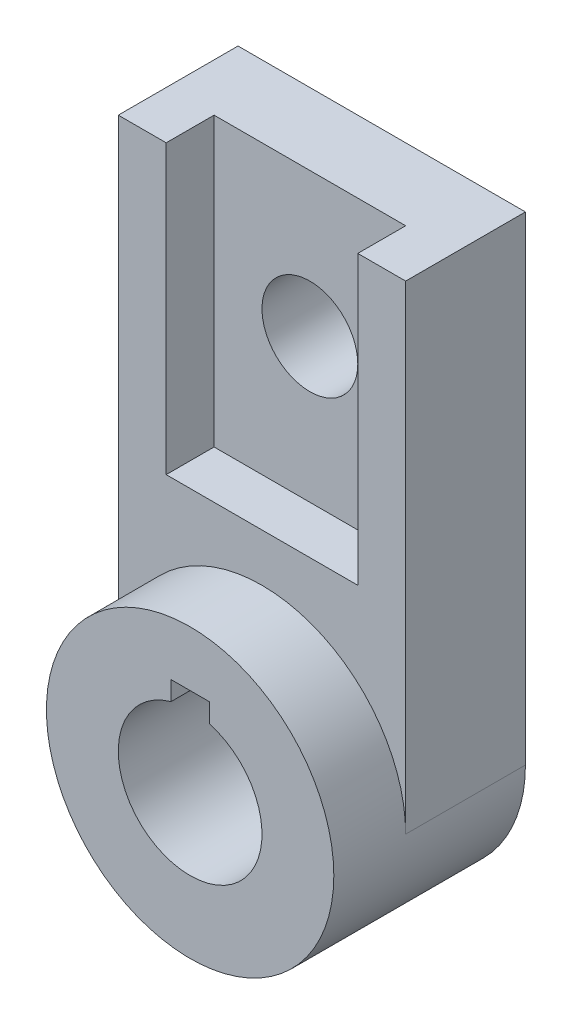
ISO-10303-21;
HEADER;
FILE_DESCRIPTION(('STEP AP214'),'2;1');
FILE_NAME('part.step','',(''),(''),'','','');
FILE_SCHEMA(('AUTOMOTIVE_DESIGN { 1 0 10303 214 1 1 1 1 }'));
ENDSEC;
DATA;
#1=APPLICATION_CONTEXT('core data for automotive mechanical design processes');
#2=APPLICATION_PROTOCOL_DEFINITION('international standard','automotive_design',2000,#1);
#3=PRODUCT_CONTEXT('',#1,'mechanical');
#4=PRODUCT('Part','Part','',(#3));
#5=PRODUCT_RELATED_PRODUCT_CATEGORY('part','',(#4));
#6=PRODUCT_DEFINITION_FORMATION('','',#4);
#7=PRODUCT_DEFINITION_CONTEXT('part definition',#1,'design');
#8=PRODUCT_DEFINITION('design','',#6,#7);
#9=PRODUCT_DEFINITION_SHAPE('','',#8);
#10=(LENGTH_UNIT() NAMED_UNIT(*) SI_UNIT(.MILLI.,.METRE.));
#11=(NAMED_UNIT(*) PLANE_ANGLE_UNIT() SI_UNIT($,.RADIAN.));
#12=(NAMED_UNIT(*) SI_UNIT($,.STERADIAN.) SOLID_ANGLE_UNIT());
#13=UNCERTAINTY_MEASURE_WITH_UNIT(LENGTH_MEASURE(1.E-05),#10,'distance_accuracy_value','');
#14=(GEOMETRIC_REPRESENTATION_CONTEXT(3) GLOBAL_UNCERTAINTY_ASSIGNED_CONTEXT((#13)) GLOBAL_UNIT_ASSIGNED_CONTEXT((#10,
#11,#12)) REPRESENTATION_CONTEXT('',''));
#15=CARTESIAN_POINT('',(0.,0.,0.));
#16=DIRECTION('',(0.,0.,1.));
#17=DIRECTION('',(1.,0.,0.));
#18=AXIS2_PLACEMENT_3D('',#15,#16,#17);
#19=CARTESIAN_POINT('',(30.,0.,25.));
#20=DIRECTION('',(1.,0.,0.));
#21=DIRECTION('',(0.,1.,0.));
#22=AXIS2_PLACEMENT_3D('',#19,#20,#21);
#23=PLANE('',#22);
#24=DIRECTION('',(0.,-1.,0.));
#25=VECTOR('',#24,1.);
#26=CARTESIAN_POINT('',(30.,0.,0.));
#27=LINE('',#26,#25);
#28=CARTESIAN_POINT('',(30.,100.,0.));
#29=VERTEX_POINT('',#28);
#30=CARTESIAN_POINT('',(30.,0.,0.));
#31=VERTEX_POINT('',#30);
#32=EDGE_CURVE('E168',#29,#31,#27,.T.);
#33=ORIENTED_EDGE('',*,*,#32,.F.);
#34=DIRECTION('',(0.,0.,-1.));
#35=VECTOR('',#34,1.);
#36=CARTESIAN_POINT('',(30.,100.,25.));
#37=LINE('',#36,#35);
#38=CARTESIAN_POINT('',(30.,100.,25.));
#39=VERTEX_POINT('',#38);
#40=EDGE_CURVE('E153',#39,#29,#37,.T.);
#41=ORIENTED_EDGE('',*,*,#40,.F.);
#42=DIRECTION('',(0.,-1.,0.));
#43=VECTOR('',#42,1.);
#44=CARTESIAN_POINT('',(30.,0.,25.));
#45=LINE('',#44,#43);
#46=CARTESIAN_POINT('',(30.,0.,25.));
#47=VERTEX_POINT('',#46);
#48=EDGE_CURVE('E178',#39,#47,#45,.T.);
#49=ORIENTED_EDGE('',*,*,#48,.T.);
#50=DIRECTION('',(0.,0.,-1.));
#51=VECTOR('',#50,1.);
#52=CARTESIAN_POINT('',(30.,0.,25.));
#53=LINE('',#52,#51);
#54=EDGE_CURVE('E139',#47,#31,#53,.T.);
#55=ORIENTED_EDGE('',*,*,#54,.T.);
#56=EDGE_LOOP('',(#33,#41,#49,#55));
#57=FACE_BOUND('',#56,.T.);
#58=ADVANCED_FACE('F39',(#57),#23,.T.);
#59=CARTESIAN_POINT('',(0.,100.,25.));
#60=DIRECTION('',(0.,1.,0.));
#61=DIRECTION('',(0.,0.,1.));
#62=AXIS2_PLACEMENT_3D('',#59,#60,#61);
#63=PLANE('',#62);
#64=DIRECTION('',(0.,0.,1.));
#65=VECTOR('',#64,1.);
#66=CARTESIAN_POINT('',(-20.,100.,15.));
#67=LINE('',#66,#65);
#68=CARTESIAN_POINT('',(-20.,100.,15.));
#69=VERTEX_POINT('',#68);
#70=CARTESIAN_POINT('',(-20.,100.,25.));
#71=VERTEX_POINT('',#70);
#72=EDGE_CURVE('E184',#69,#71,#67,.T.);
#73=ORIENTED_EDGE('',*,*,#72,.F.);
#74=DIRECTION('',(-1.,0.,0.));
#75=VECTOR('',#74,1.);
#76=CARTESIAN_POINT('',(-20.,100.,15.));
#77=LINE('',#76,#75);
#78=CARTESIAN_POINT('',(20.,100.,15.));
#79=VERTEX_POINT('',#78);
#80=EDGE_CURVE('E191',#79,#69,#77,.T.);
#81=ORIENTED_EDGE('',*,*,#80,.F.);
#82=DIRECTION('',(0.,0.,1.));
#83=VECTOR('',#82,1.);
#84=CARTESIAN_POINT('',(20.,100.,15.));
#85=LINE('',#84,#83);
#86=CARTESIAN_POINT('',(20.,100.,25.));
#87=VERTEX_POINT('',#86);
#88=EDGE_CURVE('E193',#79,#87,#85,.T.);
#89=ORIENTED_EDGE('',*,*,#88,.T.);
#90=DIRECTION('',(1.,0.,0.));
#91=VECTOR('',#90,1.);
#92=CARTESIAN_POINT('',(0.,100.,25.));
#93=LINE('',#92,#91);
#94=EDGE_CURVE('E177',#87,#39,#93,.T.);
#95=ORIENTED_EDGE('',*,*,#94,.T.);
#96=ORIENTED_EDGE('',*,*,#40,.T.);
#97=DIRECTION('',(1.,0.,0.));
#98=VECTOR('',#97,1.);
#99=CARTESIAN_POINT('',(0.,100.,0.));
#100=LINE('',#99,#98);
#101=CARTESIAN_POINT('',(-30.,100.,0.));
#102=VERTEX_POINT('',#101);
#103=EDGE_CURVE('E165',#102,#29,#100,.T.);
#104=ORIENTED_EDGE('',*,*,#103,.F.);
#105=DIRECTION('',(0.,0.,-1.));
#106=VECTOR('',#105,1.);
#107=CARTESIAN_POINT('',(-30.,100.,25.));
#108=LINE('',#107,#106);
#109=CARTESIAN_POINT('',(-30.,100.,25.));
#110=VERTEX_POINT('',#109);
#111=EDGE_CURVE('E155',#110,#102,#108,.T.);
#112=ORIENTED_EDGE('',*,*,#111,.F.);
#113=EDGE_CURVE('E174',#110,#71,#93,.T.);
#114=ORIENTED_EDGE('',*,*,#113,.T.);
#115=EDGE_LOOP('',(#73,#81,#89,#95,#96,#104,#112,#114));
#116=FACE_BOUND('',#115,.T.);
#117=ADVANCED_FACE('F246',(#116),#63,.T.);
#118=CARTESIAN_POINT('',(-30.,0.,25.));
#119=DIRECTION('',(-1.,0.,0.));
#120=DIRECTION('',(0.,-1.,0.));
#121=AXIS2_PLACEMENT_3D('',#118,#119,#120);
#122=PLANE('',#121);
#123=DIRECTION('',(0.,1.,0.));
#124=VECTOR('',#123,1.);
#125=CARTESIAN_POINT('',(-30.,0.,0.));
#126=LINE('',#125,#124);
#127=CARTESIAN_POINT('',(-30.,0.,0.));
#128=VERTEX_POINT('',#127);
#129=EDGE_CURVE('E161',#128,#102,#126,.T.);
#130=ORIENTED_EDGE('',*,*,#129,.F.);
#131=DIRECTION('',(0.,0.,-1.));
#132=VECTOR('',#131,1.);
#133=CARTESIAN_POINT('',(-30.,0.,25.));
#134=LINE('',#133,#132);
#135=CARTESIAN_POINT('',(-30.,0.,25.));
#136=VERTEX_POINT('',#135);
#137=EDGE_CURVE('E157',#136,#128,#134,.T.);
#138=ORIENTED_EDGE('',*,*,#137,.F.);
#139=DIRECTION('',(0.,1.,0.));
#140=VECTOR('',#139,1.);
#141=CARTESIAN_POINT('',(-30.,0.,25.));
#142=LINE('',#141,#140);
#143=EDGE_CURVE('E160',#136,#110,#142,.T.);
#144=ORIENTED_EDGE('',*,*,#143,.T.);
#145=ORIENTED_EDGE('',*,*,#111,.T.);
#146=EDGE_LOOP('',(#130,#138,#144,#145));
#147=FACE_BOUND('',#146,.T.);
#148=ADVANCED_FACE('F252',(#147),#122,.T.);
#149=CARTESIAN_POINT('',(0.,0.,25.));
#150=DIRECTION('',(0.,0.,1.));
#151=DIRECTION('',(1.,0.,0.));
#152=AXIS2_PLACEMENT_3D('',#149,#150,#151);
#153=PLANE('',#152);
#154=DIRECTION('',(0.,-1.,0.));
#155=VECTOR('',#154,1.);
#156=CARTESIAN_POINT('',(-20.,100.,25.));
#157=LINE('',#156,#155);
#158=CARTESIAN_POINT('',(-20.,40.,25.));
#159=VERTEX_POINT('',#158);
#160=EDGE_CURVE('E149',#71,#159,#157,.T.);
#161=ORIENTED_EDGE('',*,*,#160,.F.);
#162=ORIENTED_EDGE('',*,*,#113,.F.);
#163=ORIENTED_EDGE('',*,*,#143,.F.);
#164=CARTESIAN_POINT('',(0.,0.,25.));
#165=DIRECTION('',(0.,0.,1.));
#166=DIRECTION('',(1.,0.,0.));
#167=AXIS2_PLACEMENT_3D('',#164,#165,#166);
#168=CIRCLE('',#167,30.);
#169=EDGE_CURVE('E164',#47,#136,#168,.T.);
#170=ORIENTED_EDGE('',*,*,#169,.F.);
#171=ORIENTED_EDGE('',*,*,#48,.F.);
#172=ORIENTED_EDGE('',*,*,#94,.F.);
#173=DIRECTION('',(0.,1.,0.));
#174=VECTOR('',#173,1.);
#175=CARTESIAN_POINT('',(20.,100.,25.));
#176=LINE('',#175,#174);
#177=CARTESIAN_POINT('',(20.,40.,25.));
#178=VERTEX_POINT('',#177);
#179=EDGE_CURVE('E197',#178,#87,#176,.T.);
#180=ORIENTED_EDGE('',*,*,#179,.F.);
#181=DIRECTION('',(1.,0.,0.));
#182=VECTOR('',#181,1.);
#183=CARTESIAN_POINT('',(-20.,40.,25.));
#184=LINE('',#183,#182);
#185=EDGE_CURVE('E200',#159,#178,#184,.T.);
#186=ORIENTED_EDGE('',*,*,#185,.F.);
#187=EDGE_LOOP('',(#161,#162,#163,#170,#171,#172,#180,#186));
#188=FACE_BOUND('',#187,.T.);
#189=ADVANCED_FACE('F267',(#188),#153,.T.);
#190=CARTESIAN_POINT('',(0.,0.,0.));
#191=DIRECTION('',(0.,0.,1.));
#192=DIRECTION('',(1.,0.,0.));
#193=AXIS2_PLACEMENT_3D('',#190,#191,#192);
#194=PLANE('',#193);
#195=DIRECTION('',(-1.,0.,0.));
#196=VECTOR('',#195,1.);
#197=CARTESIAN_POINT('',(-4.,18.456832294801,0.));
#198=LINE('',#197,#196);
#199=CARTESIAN_POINT('',(4.,18.456832294801,0.));
#200=VERTEX_POINT('',#199);
#201=CARTESIAN_POINT('',(-4.,18.456832294801,0.));
#202=VERTEX_POINT('',#201);
#203=EDGE_CURVE('E218',#200,#202,#198,.T.);
#204=ORIENTED_EDGE('',*,*,#203,.T.);
#205=DIRECTION('',(0.,-1.,0.));
#206=VECTOR('',#205,1.);
#207=CARTESIAN_POINT('',(-4.,18.456832294801,0.));
#208=LINE('',#207,#206);
#209=CARTESIAN_POINT('',(-4.,14.456832294801,0.));
#210=VERTEX_POINT('',#209);
#211=EDGE_CURVE('E227',#202,#210,#208,.T.);
#212=ORIENTED_EDGE('',*,*,#211,.T.);
#213=CARTESIAN_POINT('',(0.,0.,0.));
#214=DIRECTION('',(0.,0.,1.));
#215=DIRECTION('',(1.,0.,0.));
#216=AXIS2_PLACEMENT_3D('',#213,#214,#215);
#217=CIRCLE('',#216,15.);
#218=CARTESIAN_POINT('',(4.,14.456832294801,0.));
#219=VERTEX_POINT('',#218);
#220=EDGE_CURVE('E225',#210,#219,#217,.T.);
#221=ORIENTED_EDGE('',*,*,#220,.T.);
#222=DIRECTION('',(0.,1.,0.));
#223=VECTOR('',#222,1.);
#224=CARTESIAN_POINT('',(4.,18.456832294801,0.));
#225=LINE('',#224,#223);
#226=EDGE_CURVE('E56',#219,#200,#225,.T.);
#227=ORIENTED_EDGE('',*,*,#226,.T.);
#228=EDGE_LOOP('',(#204,#212,#221,#227));
#229=FACE_BOUND('',#228,.T.);
#230=CARTESIAN_POINT('',(0.,70.,0.));
#231=DIRECTION('',(0.,0.,1.));
#232=DIRECTION('',(1.,0.,0.));
#233=AXIS2_PLACEMENT_3D('',#230,#231,#232);
#234=CIRCLE('',#233,10.);
#235=CARTESIAN_POINT('',(10.,70.,0.));
#236=VERTEX_POINT('',#235);
#237=EDGE_CURVE('E150',#236,#236,#234,.T.);
#238=ORIENTED_EDGE('',*,*,#237,.T.);
#239=EDGE_LOOP('',(#238));
#240=FACE_BOUND('',#239,.T.);
#241=ORIENTED_EDGE('',*,*,#32,.T.);
#242=CARTESIAN_POINT('',(0.,0.,0.));
#243=DIRECTION('',(0.,0.,1.));
#244=DIRECTION('',(1.,0.,0.));
#245=AXIS2_PLACEMENT_3D('',#242,#243,#244);
#246=CIRCLE('',#245,30.);
#247=EDGE_CURVE('E182',#128,#31,#246,.T.);
#248=ORIENTED_EDGE('',*,*,#247,.F.);
#249=ORIENTED_EDGE('',*,*,#129,.T.);
#250=ORIENTED_EDGE('',*,*,#103,.T.);
#251=EDGE_LOOP('',(#241,#248,#249,#250));
#252=FACE_BOUND('',#251,.T.);
#253=ADVANCED_FACE('F230',(#229,#240,#252),#194,.F.);
#254=CARTESIAN_POINT('',(0.,0.,40.));
#255=DIRECTION('',(0.,0.,-1.));
#256=DIRECTION('',(-1.,0.,0.));
#257=AXIS2_PLACEMENT_3D('',#254,#255,#256);
#258=CYLINDRICAL_SURFACE('',#257,30.);
#259=CARTESIAN_POINT('',(0.,0.,40.));
#260=DIRECTION('',(0.,0.,1.));
#261=DIRECTION('',(1.,0.,0.));
#262=AXIS2_PLACEMENT_3D('',#259,#260,#261);
#263=CIRCLE('',#262,30.);
#264=CARTESIAN_POINT('',(30.,0.,40.));
#265=VERTEX_POINT('',#264);
#266=EDGE_CURVE('E171',#265,#265,#263,.T.);
#267=ORIENTED_EDGE('',*,*,#266,.F.);
#268=EDGE_LOOP('',(#267));
#269=FACE_BOUND('',#268,.T.);
#270=ORIENTED_EDGE('',*,*,#247,.T.);
#271=ORIENTED_EDGE('',*,*,#54,.F.);
#272=ORIENTED_EDGE('',*,*,#169,.T.);
#273=ORIENTED_EDGE('',*,*,#137,.T.);
#274=EDGE_LOOP('',(#270,#271,#272,#273));
#275=FACE_BOUND('',#274,.T.);
#276=ADVANCED_FACE('F273',(#269,#275),#258,.T.);
#277=CARTESIAN_POINT('',(0.,0.,40.));
#278=DIRECTION('',(0.,0.,1.));
#279=DIRECTION('',(1.,0.,0.));
#280=AXIS2_PLACEMENT_3D('',#277,#278,#279);
#281=PLANE('',#280);
#282=DIRECTION('',(0.,-1.,0.));
#283=VECTOR('',#282,1.);
#284=CARTESIAN_POINT('',(-3.99999999999999,0.,40.));
#285=LINE('',#284,#283);
#286=CARTESIAN_POINT('',(-4.,18.456832294801,40.));
#287=VERTEX_POINT('',#286);
#288=CARTESIAN_POINT('',(-4.,14.456832294801,40.));
#289=VERTEX_POINT('',#288);
#290=EDGE_CURVE('E11',#287,#289,#285,.T.);
#291=ORIENTED_EDGE('',*,*,#290,.F.);
#292=DIRECTION('',(-1.,0.,0.));
#293=VECTOR('',#292,1.);
#294=CARTESIAN_POINT('',(0.,18.456832294801,40.));
#295=LINE('',#294,#293);
#296=CARTESIAN_POINT('',(4.,18.456832294801,40.));
#297=VERTEX_POINT('',#296);
#298=EDGE_CURVE('E48',#297,#287,#295,.T.);
#299=ORIENTED_EDGE('',*,*,#298,.F.);
#300=DIRECTION('',(0.,1.,0.));
#301=VECTOR('',#300,1.);
#302=CARTESIAN_POINT('',(3.99999999999999,0.,40.));
#303=LINE('',#302,#301);
#304=CARTESIAN_POINT('',(4.,14.456832294801,40.));
#305=VERTEX_POINT('',#304);
#306=EDGE_CURVE('E129',#305,#297,#303,.T.);
#307=ORIENTED_EDGE('',*,*,#306,.F.);
#308=CARTESIAN_POINT('',(0.,0.,40.));
#309=DIRECTION('',(0.,0.,1.));
#310=DIRECTION('',(1.,0.,0.));
#311=AXIS2_PLACEMENT_3D('',#308,#309,#310);
#312=CIRCLE('',#311,15.);
#313=EDGE_CURVE('E42',#289,#305,#312,.T.);
#314=ORIENTED_EDGE('',*,*,#313,.F.);
#315=EDGE_LOOP('',(#291,#299,#307,#314));
#316=FACE_BOUND('',#315,.T.);
#317=ORIENTED_EDGE('',*,*,#266,.T.);
#318=EDGE_LOOP('',(#317));
#319=FACE_BOUND('',#318,.T.);
#320=ADVANCED_FACE('F141',(#316,#319),#281,.T.);
#321=CARTESIAN_POINT('',(-20.,100.,15.));
#322=DIRECTION('',(-1.,0.,0.));
#323=DIRECTION('',(0.,-1.,0.));
#324=AXIS2_PLACEMENT_3D('',#321,#322,#323);
#325=PLANE('',#324);
#326=ORIENTED_EDGE('',*,*,#160,.T.);
#327=DIRECTION('',(0.,0.,1.));
#328=VECTOR('',#327,1.);
#329=CARTESIAN_POINT('',(-20.,40.,15.));
#330=LINE('',#329,#328);
#331=CARTESIAN_POINT('',(-20.,40.,15.));
#332=VERTEX_POINT('',#331);
#333=EDGE_CURVE('E187',#332,#159,#330,.T.);
#334=ORIENTED_EDGE('',*,*,#333,.F.);
#335=DIRECTION('',(0.,-1.,0.));
#336=VECTOR('',#335,1.);
#337=CARTESIAN_POINT('',(-20.,100.,15.));
#338=LINE('',#337,#336);
#339=EDGE_CURVE('E199',#69,#332,#338,.T.);
#340=ORIENTED_EDGE('',*,*,#339,.F.);
#341=ORIENTED_EDGE('',*,*,#72,.T.);
#342=EDGE_LOOP('',(#326,#334,#340,#341));
#343=FACE_BOUND('',#342,.T.);
#344=ADVANCED_FACE('F288',(#343),#325,.F.);
#345=CARTESIAN_POINT('',(20.,100.,15.));
#346=DIRECTION('',(1.,0.,0.));
#347=DIRECTION('',(0.,1.,0.));
#348=AXIS2_PLACEMENT_3D('',#345,#346,#347);
#349=PLANE('',#348);
#350=ORIENTED_EDGE('',*,*,#179,.T.);
#351=ORIENTED_EDGE('',*,*,#88,.F.);
#352=DIRECTION('',(0.,1.,0.));
#353=VECTOR('',#352,1.);
#354=CARTESIAN_POINT('',(20.,100.,15.));
#355=LINE('',#354,#353);
#356=CARTESIAN_POINT('',(20.,40.,15.));
#357=VERTEX_POINT('',#356);
#358=EDGE_CURVE('E206',#357,#79,#355,.T.);
#359=ORIENTED_EDGE('',*,*,#358,.F.);
#360=DIRECTION('',(0.,0.,1.));
#361=VECTOR('',#360,1.);
#362=CARTESIAN_POINT('',(20.,40.,15.));
#363=LINE('',#362,#361);
#364=EDGE_CURVE('E190',#357,#178,#363,.T.);
#365=ORIENTED_EDGE('',*,*,#364,.T.);
#366=EDGE_LOOP('',(#350,#351,#359,#365));
#367=FACE_BOUND('',#366,.T.);
#368=ADVANCED_FACE('F291',(#367),#349,.F.);
#369=CARTESIAN_POINT('',(-20.,40.,15.));
#370=DIRECTION('',(0.,-1.,0.));
#371=DIRECTION('',(0.,0.,-1.));
#372=AXIS2_PLACEMENT_3D('',#369,#370,#371);
#373=PLANE('',#372);
#374=ORIENTED_EDGE('',*,*,#185,.T.);
#375=ORIENTED_EDGE('',*,*,#364,.F.);
#376=DIRECTION('',(1.,0.,0.));
#377=VECTOR('',#376,1.);
#378=CARTESIAN_POINT('',(-20.,40.,15.));
#379=LINE('',#378,#377);
#380=EDGE_CURVE('E209',#332,#357,#379,.T.);
#381=ORIENTED_EDGE('',*,*,#380,.F.);
#382=ORIENTED_EDGE('',*,*,#333,.T.);
#383=EDGE_LOOP('',(#374,#375,#381,#382));
#384=FACE_BOUND('',#383,.T.);
#385=ADVANCED_FACE('F293',(#384),#373,.F.);
#386=CARTESIAN_POINT('',(0.,0.,15.));
#387=DIRECTION('',(0.,0.,1.));
#388=DIRECTION('',(1.,0.,0.));
#389=AXIS2_PLACEMENT_3D('',#386,#387,#388);
#390=PLANE('',#389);
#391=CARTESIAN_POINT('',(0.,70.,15.));
#392=DIRECTION('',(0.,0.,1.));
#393=DIRECTION('',(1.,0.,0.));
#394=AXIS2_PLACEMENT_3D('',#391,#392,#393);
#395=CIRCLE('',#394,10.);
#396=CARTESIAN_POINT('',(10.,70.,15.));
#397=VERTEX_POINT('',#396);
#398=EDGE_CURVE('E146',#397,#397,#395,.T.);
#399=ORIENTED_EDGE('',*,*,#398,.F.);
#400=EDGE_LOOP('',(#399));
#401=FACE_BOUND('',#400,.T.);
#402=ORIENTED_EDGE('',*,*,#339,.T.);
#403=ORIENTED_EDGE('',*,*,#380,.T.);
#404=ORIENTED_EDGE('',*,*,#358,.T.);
#405=ORIENTED_EDGE('',*,*,#80,.T.);
#406=EDGE_LOOP('',(#402,#403,#404,#405));
#407=FACE_BOUND('',#406,.T.);
#408=ADVANCED_FACE('F296',(#401,#407),#390,.T.);
#409=CARTESIAN_POINT('',(0.,70.,0.));
#410=DIRECTION('',(0.,0.,1.));
#411=DIRECTION('',(1.,0.,0.));
#412=AXIS2_PLACEMENT_3D('',#409,#410,#411);
#413=CYLINDRICAL_SURFACE('',#412,10.);
#414=CARTESIAN_POINT('',(10.,70.,15.));
#415=CARTESIAN_POINT('',(10.,70.,14.84375));
#416=CARTESIAN_POINT('',(10.,70.,14.6875));
#417=CARTESIAN_POINT('',(10.,70.,14.375));
#418=CARTESIAN_POINT('',(10.,70.,14.21875));
#419=CARTESIAN_POINT('',(10.,70.,13.90625));
#420=CARTESIAN_POINT('',(10.,70.,13.75));
#421=CARTESIAN_POINT('',(10.,70.,13.4375));
#422=CARTESIAN_POINT('',(10.,70.,13.28125));
#423=CARTESIAN_POINT('',(10.,70.,12.96875));
#424=CARTESIAN_POINT('',(10.,70.,12.8125));
#425=CARTESIAN_POINT('',(10.,70.,12.5));
#426=CARTESIAN_POINT('',(10.,70.,12.34375));
#427=CARTESIAN_POINT('',(10.,70.,12.03125));
#428=CARTESIAN_POINT('',(10.,70.,11.875));
#429=CARTESIAN_POINT('',(10.,70.,11.5625));
#430=CARTESIAN_POINT('',(10.,70.,11.40625));
#431=CARTESIAN_POINT('',(10.,70.,11.09375));
#432=CARTESIAN_POINT('',(10.,70.,10.9375));
#433=CARTESIAN_POINT('',(10.,70.,10.625));
#434=CARTESIAN_POINT('',(10.,70.,10.46875));
#435=CARTESIAN_POINT('',(10.,70.,10.15625));
#436=CARTESIAN_POINT('',(10.,70.,10.));
#437=CARTESIAN_POINT('',(10.,70.,9.6875));
#438=CARTESIAN_POINT('',(10.,70.,9.53125));
#439=CARTESIAN_POINT('',(10.,70.,9.21875));
#440=CARTESIAN_POINT('',(10.,70.,9.0625));
#441=CARTESIAN_POINT('',(10.,70.,8.75));
#442=CARTESIAN_POINT('',(10.,70.,8.59375));
#443=CARTESIAN_POINT('',(10.,70.,8.28125));
#444=CARTESIAN_POINT('',(10.,70.,8.125));
#445=CARTESIAN_POINT('',(10.,70.,7.8125));
#446=CARTESIAN_POINT('',(10.,70.,7.65625));
#447=CARTESIAN_POINT('',(10.,70.,7.34375));
#448=CARTESIAN_POINT('',(10.,70.,7.1875));
#449=CARTESIAN_POINT('',(10.,70.,6.875));
#450=CARTESIAN_POINT('',(10.,70.,6.71875));
#451=CARTESIAN_POINT('',(10.,70.,6.40625));
#452=CARTESIAN_POINT('',(10.,70.,6.25));
#453=CARTESIAN_POINT('',(10.,70.,5.9375));
#454=CARTESIAN_POINT('',(10.,70.,5.78125));
#455=CARTESIAN_POINT('',(10.,70.,5.46875));
#456=CARTESIAN_POINT('',(10.,70.,5.3125));
#457=CARTESIAN_POINT('',(10.,70.,5.));
#458=CARTESIAN_POINT('',(10.,70.,4.84375));
#459=CARTESIAN_POINT('',(10.,70.,4.53125));
#460=CARTESIAN_POINT('',(10.,70.,4.375));
#461=CARTESIAN_POINT('',(10.,70.,4.0625));
#462=CARTESIAN_POINT('',(10.,70.,3.90625));
#463=CARTESIAN_POINT('',(10.,70.,3.59375));
#464=CARTESIAN_POINT('',(10.,70.,3.4375));
#465=CARTESIAN_POINT('',(10.,70.,3.125));
#466=CARTESIAN_POINT('',(10.,70.,2.96875));
#467=CARTESIAN_POINT('',(10.,70.,2.65625));
#468=CARTESIAN_POINT('',(10.,70.,2.5));
#469=CARTESIAN_POINT('',(10.,70.,2.1875));
#470=CARTESIAN_POINT('',(10.,70.,2.03125));
#471=CARTESIAN_POINT('',(10.,70.,1.71875));
#472=CARTESIAN_POINT('',(10.,70.,1.5625));
#473=CARTESIAN_POINT('',(10.,70.,1.25));
#474=CARTESIAN_POINT('',(10.,70.,1.09375));
#475=CARTESIAN_POINT('',(10.,70.,0.781250000000001));
#476=CARTESIAN_POINT('',(10.,70.,0.625));
#477=CARTESIAN_POINT('',(10.,70.,0.3125));
#478=CARTESIAN_POINT('',(10.,70.,0.15625));
#479=CARTESIAN_POINT('',(10.,70.,0.));
#480=B_SPLINE_CURVE_WITH_KNOTS('',3,(#414,#415,#416,#417,#418,#419,#420,#421,#422,#423,#424,
#425,#426,#427,#428,#429,#430,#431,#432,#433,#434,#435,#436,#437,#438,#439,#440,#441,#442,#443,
#444,#445,#446,#447,#448,#449,#450,#451,#452,#453,#454,#455,#456,#457,#458,#459,#460,#461,#462,
#463,#464,#465,#466,#467,#468,#469,#470,#471,#472,#473,#474,#475,#476,#477,#478,#479),
.UNSPECIFIED.,.F.,.F.,(4,2,2,2,2,2,2,2,2,2,2,2,2,2,2,2,2,2,2,2,2,2,2,2,2,2,2,2,2,2,2,2,4),(0.,
0.46875,0.937500000000001,1.40625,1.875,2.34375,2.8125,3.28125,3.75,4.21875,4.6875,5.15625,
5.625,6.09375,6.5625,7.03125,7.5,7.96875,8.4375,8.90625,9.375,9.84375,10.3125,10.78125,11.25,
11.71875,12.1875,12.65625,13.125,13.59375,14.0625,14.53125,15.),.UNSPECIFIED.);
#481=EDGE_CURVE('BSEAM243',#397,#236,#480,.T.);
#482=ORIENTED_EDGE('',*,*,#398,.T.);
#483=ORIENTED_EDGE('',*,*,#237,.F.);
#484=ORIENTED_EDGE('',*,*,#481,.T.);
#485=ORIENTED_EDGE('',*,*,#481,.F.);
#486=EDGE_LOOP('',(#482,#484,#483,#485));
#487=FACE_BOUND('',#486,.T.);
#488=ADVANCED_FACE('F243',(#487),#413,.F.);
#489=CARTESIAN_POINT('',(-4.,18.456832294801,0.));
#490=DIRECTION('',(-1.,0.,0.));
#491=DIRECTION('',(0.,-1.,0.));
#492=AXIS2_PLACEMENT_3D('',#489,#490,#491);
#493=PLANE('',#492);
#494=ORIENTED_EDGE('',*,*,#290,.T.);
#495=DIRECTION('',(0.,0.,1.));
#496=VECTOR('',#495,1.);
#497=CARTESIAN_POINT('',(-4.,14.456832294801,0.));
#498=LINE('',#497,#496);
#499=EDGE_CURVE('E123',#210,#289,#498,.T.);
#500=ORIENTED_EDGE('',*,*,#499,.F.);
#501=ORIENTED_EDGE('',*,*,#211,.F.);
#502=DIRECTION('',(0.,0.,1.));
#503=VECTOR('',#502,1.);
#504=CARTESIAN_POINT('',(-4.,18.456832294801,0.));
#505=LINE('',#504,#503);
#506=EDGE_CURVE('E215',#202,#287,#505,.T.);
#507=ORIENTED_EDGE('',*,*,#506,.T.);
#508=EDGE_LOOP('',(#494,#500,#501,#507));
#509=FACE_BOUND('',#508,.T.);
#510=ADVANCED_FACE('F233',(#509),#493,.F.);
#511=CARTESIAN_POINT('',(-4.,18.456832294801,0.));
#512=DIRECTION('',(0.,1.,0.));
#513=DIRECTION('',(0.,0.,1.));
#514=AXIS2_PLACEMENT_3D('',#511,#512,#513);
#515=PLANE('',#514);
#516=ORIENTED_EDGE('',*,*,#298,.T.);
#517=ORIENTED_EDGE('',*,*,#506,.F.);
#518=ORIENTED_EDGE('',*,*,#203,.F.);
#519=DIRECTION('',(0.,0.,1.));
#520=VECTOR('',#519,1.);
#521=CARTESIAN_POINT('',(4.,18.456832294801,0.));
#522=LINE('',#521,#520);
#523=EDGE_CURVE('E133',#200,#297,#522,.T.);
#524=ORIENTED_EDGE('',*,*,#523,.T.);
#525=EDGE_LOOP('',(#516,#517,#518,#524));
#526=FACE_BOUND('',#525,.T.);
#527=ADVANCED_FACE('F235',(#526),#515,.F.);
#528=CARTESIAN_POINT('',(4.,18.456832294801,0.));
#529=DIRECTION('',(1.,0.,0.));
#530=DIRECTION('',(0.,1.,0.));
#531=AXIS2_PLACEMENT_3D('',#528,#529,#530);
#532=PLANE('',#531);
#533=ORIENTED_EDGE('',*,*,#306,.T.);
#534=ORIENTED_EDGE('',*,*,#523,.F.);
#535=ORIENTED_EDGE('',*,*,#226,.F.);
#536=DIRECTION('',(0.,0.,1.));
#537=VECTOR('',#536,1.);
#538=CARTESIAN_POINT('',(4.,14.456832294801,0.));
#539=LINE('',#538,#537);
#540=EDGE_CURVE('E125',#219,#305,#539,.T.);
#541=ORIENTED_EDGE('',*,*,#540,.T.);
#542=EDGE_LOOP('',(#533,#534,#535,#541));
#543=FACE_BOUND('',#542,.T.);
#544=ADVANCED_FACE('F127',(#543),#532,.F.);
#545=CARTESIAN_POINT('',(0.,0.,0.));
#546=DIRECTION('',(0.,0.,1.));
#547=DIRECTION('',(1.,0.,0.));
#548=AXIS2_PLACEMENT_3D('',#545,#546,#547);
#549=CYLINDRICAL_SURFACE('',#548,15.);
#550=ORIENTED_EDGE('',*,*,#313,.T.);
#551=ORIENTED_EDGE('',*,*,#540,.F.);
#552=ORIENTED_EDGE('',*,*,#220,.F.);
#553=ORIENTED_EDGE('',*,*,#499,.T.);
#554=EDGE_LOOP('',(#550,#551,#552,#553));
#555=FACE_BOUND('',#554,.T.);
#556=ADVANCED_FACE('F136',(#555),#549,.F.);
#557=CLOSED_SHELL('',(#58,#117,#148,#189,#253,#276,#320,#344,#368,#385,#408,#488,#510,#527,#544,#556));
#558=MANIFOLD_SOLID_BREP('B2',#557);
#559=ADVANCED_BREP_SHAPE_REPRESENTATION('',(#18,#558),#14);
#560=SHAPE_DEFINITION_REPRESENTATION(#9,#559);
ENDSEC;
END-ISO-10303-21;
